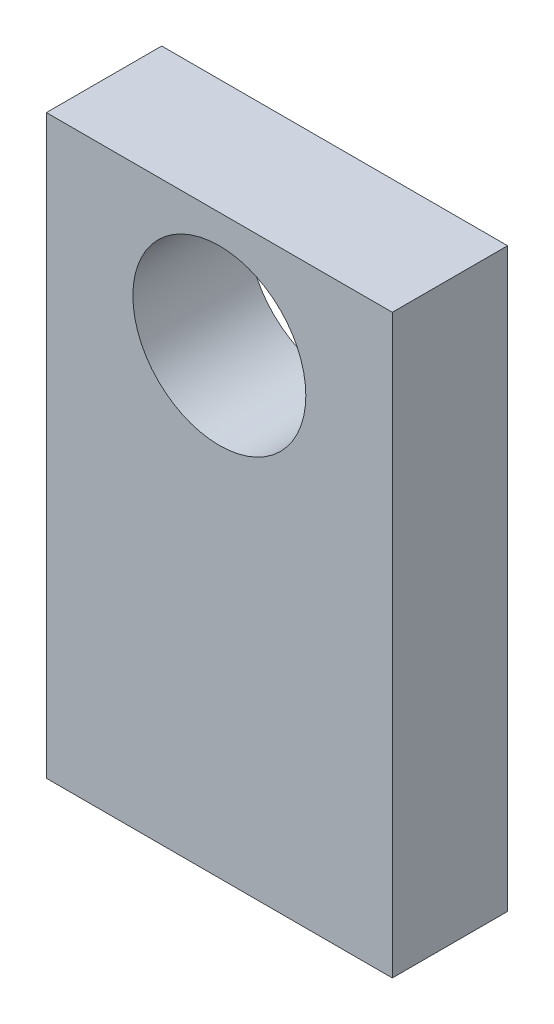
ISO-10303-21;
HEADER;
FILE_DESCRIPTION(('STEP AP214'),'2;1');
FILE_NAME('part.step','',(''),(''),'','','');
FILE_SCHEMA(('AUTOMOTIVE_DESIGN { 1 0 10303 214 1 1 1 1 }'));
ENDSEC;
DATA;
#1=APPLICATION_CONTEXT('core data for automotive mechanical design processes');
#2=APPLICATION_PROTOCOL_DEFINITION('international standard','automotive_design',2000,#1);
#3=PRODUCT_CONTEXT('',#1,'mechanical');
#4=PRODUCT('Part','Part','',(#3));
#5=PRODUCT_RELATED_PRODUCT_CATEGORY('part','',(#4));
#6=PRODUCT_DEFINITION_FORMATION('','',#4);
#7=PRODUCT_DEFINITION_CONTEXT('part definition',#1,'design');
#8=PRODUCT_DEFINITION('design','',#6,#7);
#9=PRODUCT_DEFINITION_SHAPE('','',#8);
#10=(LENGTH_UNIT() NAMED_UNIT(*) SI_UNIT(.MILLI.,.METRE.));
#11=(NAMED_UNIT(*) PLANE_ANGLE_UNIT() SI_UNIT($,.RADIAN.));
#12=(NAMED_UNIT(*) SI_UNIT($,.STERADIAN.) SOLID_ANGLE_UNIT());
#13=UNCERTAINTY_MEASURE_WITH_UNIT(LENGTH_MEASURE(1.E-05),#10,'distance_accuracy_value','');
#14=(GEOMETRIC_REPRESENTATION_CONTEXT(3) GLOBAL_UNCERTAINTY_ASSIGNED_CONTEXT((#13)) GLOBAL_UNIT_ASSIGNED_CONTEXT((#10,
#11,#12)) REPRESENTATION_CONTEXT('',''));
#15=CARTESIAN_POINT('',(0.,0.,0.));
#16=DIRECTION('',(0.,0.,1.));
#17=DIRECTION('',(1.,0.,0.));
#18=AXIS2_PLACEMENT_3D('',#15,#16,#17);
#19=CARTESIAN_POINT('',(0.,0.,10.));
#20=DIRECTION('',(0.,0.,1.));
#21=DIRECTION('',(1.,0.,0.));
#22=AXIS2_PLACEMENT_3D('',#19,#20,#21);
#23=PLANE('',#22);
#24=DIRECTION('',(0.,-1.,0.));
#25=VECTOR('',#24,1.);
#26=CARTESIAN_POINT('',(-15.,-25.,10.));
#27=LINE('',#26,#25);
#28=CARTESIAN_POINT('',(-15.,25.,10.));
#29=VERTEX_POINT('',#28);
#30=CARTESIAN_POINT('',(-15.,-25.,10.));
#31=VERTEX_POINT('',#30);
#32=EDGE_CURVE('E92',#29,#31,#27,.T.);
#33=ORIENTED_EDGE('',*,*,#32,.T.);
#34=DIRECTION('',(1.,0.,0.));
#35=VECTOR('',#34,1.);
#36=CARTESIAN_POINT('',(15.,-25.,10.));
#37=LINE('',#36,#35);
#38=CARTESIAN_POINT('',(15.,-25.,10.));
#39=VERTEX_POINT('',#38);
#40=EDGE_CURVE('E87',#31,#39,#37,.T.);
#41=ORIENTED_EDGE('',*,*,#40,.T.);
#42=DIRECTION('',(0.,1.,0.));
#43=VECTOR('',#42,1.);
#44=CARTESIAN_POINT('',(15.,-25.,10.));
#45=LINE('',#44,#43);
#46=CARTESIAN_POINT('',(15.,25.,10.));
#47=VERTEX_POINT('',#46);
#48=EDGE_CURVE('E90',#39,#47,#45,.T.);
#49=ORIENTED_EDGE('',*,*,#48,.T.);
#50=DIRECTION('',(-1.,0.,0.));
#51=VECTOR('',#50,1.);
#52=CARTESIAN_POINT('',(15.,25.,10.));
#53=LINE('',#52,#51);
#54=EDGE_CURVE('E57',#47,#29,#53,.T.);
#55=ORIENTED_EDGE('',*,*,#54,.T.);
#56=EDGE_LOOP('',(#33,#41,#49,#55));
#57=FACE_BOUND('',#56,.T.);
#58=CARTESIAN_POINT('',(0.,15.,10.));
#59=DIRECTION('',(0.,0.,1.));
#60=DIRECTION('',(1.,0.,0.));
#61=AXIS2_PLACEMENT_3D('',#58,#59,#60);
#62=CIRCLE('',#61,7.5);
#63=CARTESIAN_POINT('',(7.5,15.,10.));
#64=VERTEX_POINT('',#63);
#65=EDGE_CURVE('E112',#64,#64,#62,.T.);
#66=ORIENTED_EDGE('',*,*,#65,.F.);
#67=EDGE_LOOP('',(#66));
#68=FACE_BOUND('',#67,.T.);
#69=ADVANCED_FACE('F39',(#57,#68),#23,.T.);
#70=CARTESIAN_POINT('',(0.,0.,0.));
#71=DIRECTION('',(0.,0.,1.));
#72=DIRECTION('',(1.,0.,0.));
#73=AXIS2_PLACEMENT_3D('',#70,#71,#72);
#74=PLANE('',#73);
#75=DIRECTION('',(0.,-1.,0.));
#76=VECTOR('',#75,1.);
#77=CARTESIAN_POINT('',(-15.,-25.,0.));
#78=LINE('',#77,#76);
#79=CARTESIAN_POINT('',(-15.,25.,0.));
#80=VERTEX_POINT('',#79);
#81=CARTESIAN_POINT('',(-15.,-25.,0.));
#82=VERTEX_POINT('',#81);
#83=EDGE_CURVE('E108',#80,#82,#78,.T.);
#84=ORIENTED_EDGE('',*,*,#83,.F.);
#85=DIRECTION('',(-1.,0.,0.));
#86=VECTOR('',#85,1.);
#87=CARTESIAN_POINT('',(15.,25.,0.));
#88=LINE('',#87,#86);
#89=CARTESIAN_POINT('',(15.,25.,0.));
#90=VERTEX_POINT('',#89);
#91=EDGE_CURVE('E80',#90,#80,#88,.T.);
#92=ORIENTED_EDGE('',*,*,#91,.F.);
#93=DIRECTION('',(0.,1.,0.));
#94=VECTOR('',#93,1.);
#95=CARTESIAN_POINT('',(15.,-25.,0.));
#96=LINE('',#95,#94);
#97=CARTESIAN_POINT('',(15.,-25.,0.));
#98=VERTEX_POINT('',#97);
#99=EDGE_CURVE('E74',#98,#90,#96,.T.);
#100=ORIENTED_EDGE('',*,*,#99,.F.);
#101=DIRECTION('',(1.,0.,0.));
#102=VECTOR('',#101,1.);
#103=CARTESIAN_POINT('',(15.,-25.,0.));
#104=LINE('',#103,#102);
#105=EDGE_CURVE('E97',#82,#98,#104,.T.);
#106=ORIENTED_EDGE('',*,*,#105,.F.);
#107=EDGE_LOOP('',(#84,#92,#100,#106));
#108=FACE_BOUND('',#107,.T.);
#109=CARTESIAN_POINT('',(0.,15.,0.));
#110=DIRECTION('',(0.,0.,1.));
#111=DIRECTION('',(1.,0.,0.));
#112=AXIS2_PLACEMENT_3D('',#109,#110,#111);
#113=CIRCLE('',#112,7.5);
#114=CARTESIAN_POINT('',(7.5,15.,0.));
#115=VERTEX_POINT('',#114);
#116=EDGE_CURVE('E130',#115,#115,#113,.T.);
#117=ORIENTED_EDGE('',*,*,#116,.T.);
#118=EDGE_LOOP('',(#117));
#119=FACE_BOUND('',#118,.T.);
#120=ADVANCED_FACE('F125',(#108,#119),#74,.F.);
#121=CARTESIAN_POINT('',(-15.,-25.,10.));
#122=DIRECTION('',(1.,0.,0.));
#123=DIRECTION('',(0.,0.,-1.));
#124=AXIS2_PLACEMENT_3D('',#121,#122,#123);
#125=PLANE('',#124);
#126=ORIENTED_EDGE('',*,*,#83,.T.);
#127=DIRECTION('',(0.,0.,-1.));
#128=VECTOR('',#127,1.);
#129=CARTESIAN_POINT('',(-15.,-25.,10.));
#130=LINE('',#129,#128);
#131=EDGE_CURVE('E11',#31,#82,#130,.T.);
#132=ORIENTED_EDGE('',*,*,#131,.F.);
#133=ORIENTED_EDGE('',*,*,#32,.F.);
#134=DIRECTION('',(0.,0.,-1.));
#135=VECTOR('',#134,1.);
#136=CARTESIAN_POINT('',(-15.,25.,10.));
#137=LINE('',#136,#135);
#138=EDGE_CURVE('E104',#29,#80,#137,.T.);
#139=ORIENTED_EDGE('',*,*,#138,.T.);
#140=EDGE_LOOP('',(#126,#132,#133,#139));
#141=FACE_BOUND('',#140,.T.);
#142=ADVANCED_FACE('F41',(#141),#125,.F.);
#143=CARTESIAN_POINT('',(15.,-25.,10.));
#144=DIRECTION('',(0.,1.,0.));
#145=DIRECTION('',(-1.,0.,0.));
#146=AXIS2_PLACEMENT_3D('',#143,#144,#145);
#147=PLANE('',#146);
#148=ORIENTED_EDGE('',*,*,#105,.T.);
#149=DIRECTION('',(0.,0.,-1.));
#150=VECTOR('',#149,1.);
#151=CARTESIAN_POINT('',(15.,-25.,10.));
#152=LINE('',#151,#150);
#153=EDGE_CURVE('E49',#39,#98,#152,.T.);
#154=ORIENTED_EDGE('',*,*,#153,.F.);
#155=ORIENTED_EDGE('',*,*,#40,.F.);
#156=ORIENTED_EDGE('',*,*,#131,.T.);
#157=EDGE_LOOP('',(#148,#154,#155,#156));
#158=FACE_BOUND('',#157,.T.);
#159=ADVANCED_FACE('F96',(#158),#147,.F.);
#160=CARTESIAN_POINT('',(15.,-25.,10.));
#161=DIRECTION('',(-1.,0.,0.));
#162=DIRECTION('',(0.,0.,1.));
#163=AXIS2_PLACEMENT_3D('',#160,#161,#162);
#164=PLANE('',#163);
#165=ORIENTED_EDGE('',*,*,#99,.T.);
#166=DIRECTION('',(0.,0.,-1.));
#167=VECTOR('',#166,1.);
#168=CARTESIAN_POINT('',(15.,25.,10.));
#169=LINE('',#168,#167);
#170=EDGE_CURVE('E99',#47,#90,#169,.T.);
#171=ORIENTED_EDGE('',*,*,#170,.F.);
#172=ORIENTED_EDGE('',*,*,#48,.F.);
#173=ORIENTED_EDGE('',*,*,#153,.T.);
#174=EDGE_LOOP('',(#165,#171,#172,#173));
#175=FACE_BOUND('',#174,.T.);
#176=ADVANCED_FACE('F100',(#175),#164,.F.);
#177=CARTESIAN_POINT('',(15.,25.,10.));
#178=DIRECTION('',(0.,-1.,0.));
#179=DIRECTION('',(1.,0.,0.));
#180=AXIS2_PLACEMENT_3D('',#177,#178,#179);
#181=PLANE('',#180);
#182=ORIENTED_EDGE('',*,*,#91,.T.);
#183=ORIENTED_EDGE('',*,*,#138,.F.);
#184=ORIENTED_EDGE('',*,*,#54,.F.);
#185=ORIENTED_EDGE('',*,*,#170,.T.);
#186=EDGE_LOOP('',(#182,#183,#184,#185));
#187=FACE_BOUND('',#186,.T.);
#188=ADVANCED_FACE('F122',(#187),#181,.F.);
#189=CARTESIAN_POINT('',(0.,15.,10.));
#190=DIRECTION('',(0.,0.,-1.));
#191=DIRECTION('',(-1.,0.,0.));
#192=AXIS2_PLACEMENT_3D('',#189,#190,#191);
#193=CYLINDRICAL_SURFACE('',#192,7.5);
#194=ORIENTED_EDGE('',*,*,#65,.T.);
#195=EDGE_LOOP('',(#194));
#196=FACE_BOUND('',#195,.T.);
#197=ORIENTED_EDGE('',*,*,#116,.F.);
#198=EDGE_LOOP('',(#197));
#199=FACE_BOUND('',#198,.T.);
#200=ADVANCED_FACE('F138',(#196,#199),#193,.F.);
#201=CLOSED_SHELL('',(#69,#120,#142,#159,#176,#188,#200));
#202=MANIFOLD_SOLID_BREP('B2',#201);
#203=ADVANCED_BREP_SHAPE_REPRESENTATION('',(#18,#202),#14);
#204=SHAPE_DEFINITION_REPRESENTATION(#9,#203);
ENDSEC;
END-ISO-10303-21;
